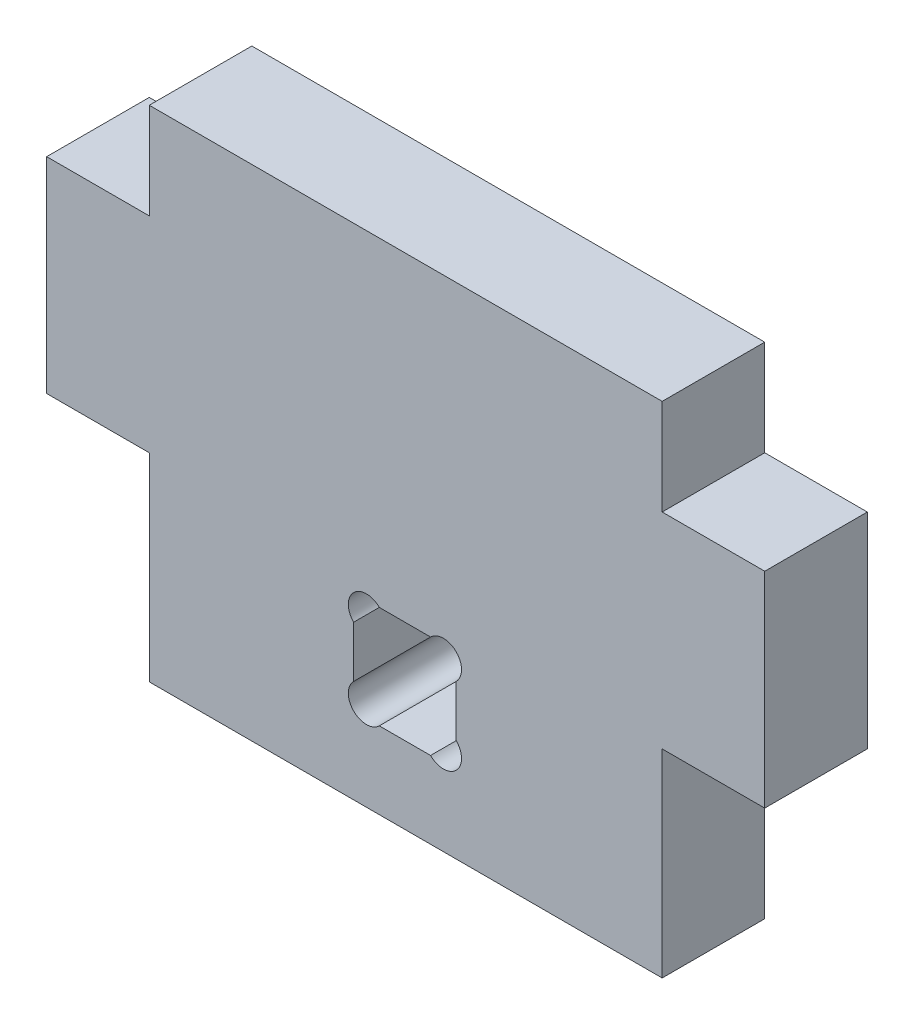
ISO-10303-21;
HEADER;
FILE_DESCRIPTION(('STEP AP214'),'2;1');
FILE_NAME('part.step','',(''),(''),'','','');
FILE_SCHEMA(('AUTOMOTIVE_DESIGN { 1 0 10303 214 1 1 1 1 }'));
ENDSEC;
DATA;
#1=APPLICATION_CONTEXT('core data for automotive mechanical design processes');
#2=APPLICATION_PROTOCOL_DEFINITION('international standard','automotive_design',2000,#1);
#3=PRODUCT_CONTEXT('',#1,'mechanical');
#4=PRODUCT('Part','Part','',(#3));
#5=PRODUCT_RELATED_PRODUCT_CATEGORY('part','',(#4));
#6=PRODUCT_DEFINITION_FORMATION('','',#4);
#7=PRODUCT_DEFINITION_CONTEXT('part definition',#1,'design');
#8=PRODUCT_DEFINITION('design','',#6,#7);
#9=PRODUCT_DEFINITION_SHAPE('','',#8);
#10=(LENGTH_UNIT() NAMED_UNIT(*) SI_UNIT(.MILLI.,.METRE.));
#11=(NAMED_UNIT(*) PLANE_ANGLE_UNIT() SI_UNIT($,.RADIAN.));
#12=(NAMED_UNIT(*) SI_UNIT($,.STERADIAN.) SOLID_ANGLE_UNIT());
#13=UNCERTAINTY_MEASURE_WITH_UNIT(LENGTH_MEASURE(1.E-05),#10,'distance_accuracy_value','');
#14=(GEOMETRIC_REPRESENTATION_CONTEXT(3) GLOBAL_UNCERTAINTY_ASSIGNED_CONTEXT((#13)) GLOBAL_UNIT_ASSIGNED_CONTEXT((#10,
#11,#12)) REPRESENTATION_CONTEXT('',''));
#15=CARTESIAN_POINT('',(0.,0.,0.));
#16=DIRECTION('',(0.,0.,1.));
#17=DIRECTION('',(1.,0.,0.));
#18=AXIS2_PLACEMENT_3D('',#15,#16,#17);
#19=CARTESIAN_POINT('',(-44.8631839710167,19.3598879782625,12.7));
#20=DIRECTION('',(1.,0.,0.));
#21=DIRECTION('',(0.,0.,-1.));
#22=AXIS2_PLACEMENT_3D('',#19,#20,#21);
#23=PLANE('',#22);
#24=DIRECTION('',(0.,-1.,0.));
#25=VECTOR('',#24,1.);
#26=CARTESIAN_POINT('',(-44.8631839710167,19.3598879782625,0.));
#27=LINE('',#26,#25);
#28=CARTESIAN_POINT('',(-44.8631839710167,19.3598879782625,0.));
#29=VERTEX_POINT('',#28);
#30=CARTESIAN_POINT('',(-44.8631839710167,-6.04011202173754,0.));
#31=VERTEX_POINT('',#30);
#32=EDGE_CURVE('E333',#29,#31,#27,.T.);
#33=ORIENTED_EDGE('',*,*,#32,.T.);
#34=DIRECTION('',(0.,0.,-1.));
#35=VECTOR('',#34,1.);
#36=CARTESIAN_POINT('',(-44.8631839710167,-6.04011202173754,12.7));
#37=LINE('',#36,#35);
#38=CARTESIAN_POINT('',(-44.8631839710167,-6.04011202173754,12.7));
#39=VERTEX_POINT('',#38);
#40=EDGE_CURVE('E12',#39,#31,#37,.T.);
#41=ORIENTED_EDGE('',*,*,#40,.F.);
#42=DIRECTION('',(0.,-1.,0.));
#43=VECTOR('',#42,1.);
#44=CARTESIAN_POINT('',(-44.8631839710167,19.3598879782625,12.7));
#45=LINE('',#44,#43);
#46=CARTESIAN_POINT('',(-44.8631839710167,19.3598879782625,12.7));
#47=VERTEX_POINT('',#46);
#48=EDGE_CURVE('E334',#47,#39,#45,.T.);
#49=ORIENTED_EDGE('',*,*,#48,.F.);
#50=DIRECTION('',(0.,0.,-1.));
#51=VECTOR('',#50,1.);
#52=CARTESIAN_POINT('',(-44.8631839710167,19.3598879782625,12.7));
#53=LINE('',#52,#51);
#54=EDGE_CURVE('E372',#47,#29,#53,.T.);
#55=ORIENTED_EDGE('',*,*,#54,.T.);
#56=EDGE_LOOP('',(#33,#41,#49,#55));
#57=FACE_BOUND('',#56,.T.);
#58=ADVANCED_FACE('F102',(#57),#23,.F.);
#59=CARTESIAN_POINT('',(-44.8631839710167,-6.04011202173754,12.7));
#60=DIRECTION('',(0.,1.,0.));
#61=DIRECTION('',(0.,0.,1.));
#62=AXIS2_PLACEMENT_3D('',#59,#60,#61);
#63=PLANE('',#62);
#64=DIRECTION('',(1.,0.,0.));
#65=VECTOR('',#64,1.);
#66=CARTESIAN_POINT('',(-44.8631839710167,-6.04011202173754,0.));
#67=LINE('',#66,#65);
#68=CARTESIAN_POINT('',(-32.1631839710167,-6.04011202173754,0.));
#69=VERTEX_POINT('',#68);
#70=EDGE_CURVE('E376',#31,#69,#67,.T.);
#71=ORIENTED_EDGE('',*,*,#70,.T.);
#72=DIRECTION('',(0.,0.,-1.));
#73=VECTOR('',#72,1.);
#74=CARTESIAN_POINT('',(-32.1631839710167,-6.04011202173754,12.7));
#75=LINE('',#74,#73);
#76=CARTESIAN_POINT('',(-32.1631839710167,-6.04011202173754,12.7));
#77=VERTEX_POINT('',#76);
#78=EDGE_CURVE('E110',#77,#69,#75,.T.);
#79=ORIENTED_EDGE('',*,*,#78,.F.);
#80=DIRECTION('',(1.,0.,0.));
#81=VECTOR('',#80,1.);
#82=CARTESIAN_POINT('',(-44.8631839710167,-6.04011202173754,12.7));
#83=LINE('',#82,#81);
#84=EDGE_CURVE('E338',#39,#77,#83,.T.);
#85=ORIENTED_EDGE('',*,*,#84,.F.);
#86=ORIENTED_EDGE('',*,*,#40,.T.);
#87=EDGE_LOOP('',(#71,#79,#85,#86));
#88=FACE_BOUND('',#87,.T.);
#89=ADVANCED_FACE('F473',(#88),#63,.F.);
#90=CARTESIAN_POINT('',(-32.1631839710167,-6.04011202173754,12.7));
#91=DIRECTION('',(1.,0.,0.));
#92=DIRECTION('',(0.,0.,-1.));
#93=AXIS2_PLACEMENT_3D('',#90,#91,#92);
#94=PLANE('',#93);
#95=DIRECTION('',(0.,-1.,0.));
#96=VECTOR('',#95,1.);
#97=CARTESIAN_POINT('',(-32.1631839710167,-6.04011202173754,0.));
#98=LINE('',#97,#96);
#99=CARTESIAN_POINT('',(-32.1631839710167,-30.6039814954239,0.));
#100=VERTEX_POINT('',#99);
#101=EDGE_CURVE('E379',#69,#100,#98,.T.);
#102=ORIENTED_EDGE('',*,*,#101,.T.);
#103=DIRECTION('',(0.,0.,-1.));
#104=VECTOR('',#103,1.);
#105=CARTESIAN_POINT('',(-32.1631839710167,-30.6039814954239,12.7));
#106=LINE('',#105,#104);
#107=CARTESIAN_POINT('',(-32.1631839710167,-30.6039814954239,12.7));
#108=VERTEX_POINT('',#107);
#109=EDGE_CURVE('E443',#108,#100,#106,.T.);
#110=ORIENTED_EDGE('',*,*,#109,.F.);
#111=DIRECTION('',(0.,-1.,0.));
#112=VECTOR('',#111,1.);
#113=CARTESIAN_POINT('',(-32.1631839710167,-6.04011202173754,12.7));
#114=LINE('',#113,#112);
#115=EDGE_CURVE('E342',#77,#108,#114,.T.);
#116=ORIENTED_EDGE('',*,*,#115,.F.);
#117=ORIENTED_EDGE('',*,*,#78,.T.);
#118=EDGE_LOOP('',(#102,#110,#116,#117));
#119=FACE_BOUND('',#118,.T.);
#120=ADVANCED_FACE('F452',(#119),#94,.F.);
#121=CARTESIAN_POINT('',(-32.1631839710167,-30.6039814954239,12.7));
#122=DIRECTION('',(0.,1.,0.));
#123=DIRECTION('',(0.,0.,1.));
#124=AXIS2_PLACEMENT_3D('',#121,#122,#123);
#125=PLANE('',#124);
#126=DIRECTION('',(1.,0.,0.));
#127=VECTOR('',#126,1.);
#128=CARTESIAN_POINT('',(-32.1631839710167,-30.6039814954239,0.));
#129=LINE('',#128,#127);
#130=CARTESIAN_POINT('',(31.3368160289834,-30.6039814954239,0.));
#131=VERTEX_POINT('',#130);
#132=EDGE_CURVE('E382',#100,#131,#129,.T.);
#133=ORIENTED_EDGE('',*,*,#132,.T.);
#134=DIRECTION('',(0.,0.,-1.));
#135=VECTOR('',#134,1.);
#136=CARTESIAN_POINT('',(31.3368160289834,-30.6039814954239,12.7));
#137=LINE('',#136,#135);
#138=CARTESIAN_POINT('',(31.3368160289834,-30.6039814954239,12.7));
#139=VERTEX_POINT('',#138);
#140=EDGE_CURVE('E439',#139,#131,#137,.T.);
#141=ORIENTED_EDGE('',*,*,#140,.F.);
#142=DIRECTION('',(1.,0.,0.));
#143=VECTOR('',#142,1.);
#144=CARTESIAN_POINT('',(-32.1631839710167,-30.6039814954239,12.7));
#145=LINE('',#144,#143);
#146=EDGE_CURVE('E345',#108,#139,#145,.T.);
#147=ORIENTED_EDGE('',*,*,#146,.F.);
#148=ORIENTED_EDGE('',*,*,#109,.T.);
#149=EDGE_LOOP('',(#133,#141,#147,#148));
#150=FACE_BOUND('',#149,.T.);
#151=ADVANCED_FACE('F463',(#150),#125,.F.);
#152=CARTESIAN_POINT('',(31.3368160289834,-6.04011202173754,12.7));
#153=DIRECTION('',(-1.,0.,0.));
#154=DIRECTION('',(0.,0.,1.));
#155=AXIS2_PLACEMENT_3D('',#152,#153,#154);
#156=PLANE('',#155);
#157=DIRECTION('',(0.,1.,0.));
#158=VECTOR('',#157,1.);
#159=CARTESIAN_POINT('',(31.3368160289834,-6.04011202173754,0.));
#160=LINE('',#159,#158);
#161=CARTESIAN_POINT('',(31.3368160289834,-6.04011202173754,0.));
#162=VERTEX_POINT('',#161);
#163=EDGE_CURVE('E385',#131,#162,#160,.T.);
#164=ORIENTED_EDGE('',*,*,#163,.T.);
#165=DIRECTION('',(0.,0.,-1.));
#166=VECTOR('',#165,1.);
#167=CARTESIAN_POINT('',(31.3368160289834,-6.04011202173754,12.7));
#168=LINE('',#167,#166);
#169=CARTESIAN_POINT('',(31.3368160289834,-6.04011202173754,12.7));
#170=VERTEX_POINT('',#169);
#171=EDGE_CURVE('E435',#170,#162,#168,.T.);
#172=ORIENTED_EDGE('',*,*,#171,.F.);
#173=DIRECTION('',(0.,1.,0.));
#174=VECTOR('',#173,1.);
#175=CARTESIAN_POINT('',(31.3368160289834,-6.04011202173754,12.7));
#176=LINE('',#175,#174);
#177=EDGE_CURVE('E348',#139,#170,#176,.T.);
#178=ORIENTED_EDGE('',*,*,#177,.F.);
#179=ORIENTED_EDGE('',*,*,#140,.T.);
#180=EDGE_LOOP('',(#164,#172,#178,#179));
#181=FACE_BOUND('',#180,.T.);
#182=ADVANCED_FACE('F467',(#181),#156,.F.);
#183=CARTESIAN_POINT('',(44.0368160289834,-6.04011202173754,12.7));
#184=DIRECTION('',(0.,1.,0.));
#185=DIRECTION('',(0.,0.,1.));
#186=AXIS2_PLACEMENT_3D('',#183,#184,#185);
#187=PLANE('',#186);
#188=DIRECTION('',(1.,0.,0.));
#189=VECTOR('',#188,1.);
#190=CARTESIAN_POINT('',(44.0368160289834,-6.04011202173754,0.));
#191=LINE('',#190,#189);
#192=CARTESIAN_POINT('',(44.0368160289834,-6.04011202173754,0.));
#193=VERTEX_POINT('',#192);
#194=EDGE_CURVE('E388',#162,#193,#191,.T.);
#195=ORIENTED_EDGE('',*,*,#194,.T.);
#196=DIRECTION('',(0.,0.,-1.));
#197=VECTOR('',#196,1.);
#198=CARTESIAN_POINT('',(44.0368160289834,-6.04011202173754,12.7));
#199=LINE('',#198,#197);
#200=CARTESIAN_POINT('',(44.0368160289834,-6.04011202173754,12.7));
#201=VERTEX_POINT('',#200);
#202=EDGE_CURVE('E431',#201,#193,#199,.T.);
#203=ORIENTED_EDGE('',*,*,#202,.F.);
#204=DIRECTION('',(1.,0.,0.));
#205=VECTOR('',#204,1.);
#206=CARTESIAN_POINT('',(44.0368160289834,-6.04011202173754,12.7));
#207=LINE('',#206,#205);
#208=EDGE_CURVE('E351',#170,#201,#207,.T.);
#209=ORIENTED_EDGE('',*,*,#208,.F.);
#210=ORIENTED_EDGE('',*,*,#171,.T.);
#211=EDGE_LOOP('',(#195,#203,#209,#210));
#212=FACE_BOUND('',#211,.T.);
#213=ADVANCED_FACE('F506',(#212),#187,.F.);
#214=CARTESIAN_POINT('',(44.0368160289834,19.3598879782625,12.7));
#215=DIRECTION('',(-1.,0.,0.));
#216=DIRECTION('',(0.,0.,1.));
#217=AXIS2_PLACEMENT_3D('',#214,#215,#216);
#218=PLANE('',#217);
#219=DIRECTION('',(0.,1.,0.));
#220=VECTOR('',#219,1.);
#221=CARTESIAN_POINT('',(44.0368160289834,19.3598879782625,0.));
#222=LINE('',#221,#220);
#223=CARTESIAN_POINT('',(44.0368160289834,19.3598879782625,0.));
#224=VERTEX_POINT('',#223);
#225=EDGE_CURVE('E391',#193,#224,#222,.T.);
#226=ORIENTED_EDGE('',*,*,#225,.T.);
#227=DIRECTION('',(0.,0.,-1.));
#228=VECTOR('',#227,1.);
#229=CARTESIAN_POINT('',(44.0368160289834,19.3598879782625,12.7));
#230=LINE('',#229,#228);
#231=CARTESIAN_POINT('',(44.0368160289834,19.3598879782625,12.7));
#232=VERTEX_POINT('',#231);
#233=EDGE_CURVE('E427',#232,#224,#230,.T.);
#234=ORIENTED_EDGE('',*,*,#233,.F.);
#235=DIRECTION('',(0.,1.,0.));
#236=VECTOR('',#235,1.);
#237=CARTESIAN_POINT('',(44.0368160289834,19.3598879782625,12.7));
#238=LINE('',#237,#236);
#239=EDGE_CURVE('E354',#201,#232,#238,.T.);
#240=ORIENTED_EDGE('',*,*,#239,.F.);
#241=ORIENTED_EDGE('',*,*,#202,.T.);
#242=EDGE_LOOP('',(#226,#234,#240,#241));
#243=FACE_BOUND('',#242,.T.);
#244=ADVANCED_FACE('F504',(#243),#218,.F.);
#245=CARTESIAN_POINT('',(44.0368160289834,19.3598879782625,12.7));
#246=DIRECTION('',(0.,-1.,0.));
#247=DIRECTION('',(0.,0.,-1.));
#248=AXIS2_PLACEMENT_3D('',#245,#246,#247);
#249=PLANE('',#248);
#250=DIRECTION('',(-1.,0.,0.));
#251=VECTOR('',#250,1.);
#252=CARTESIAN_POINT('',(44.0368160289834,19.3598879782625,0.));
#253=LINE('',#252,#251);
#254=CARTESIAN_POINT('',(31.3368160289834,19.3598879782625,0.));
#255=VERTEX_POINT('',#254);
#256=EDGE_CURVE('E394',#224,#255,#253,.T.);
#257=ORIENTED_EDGE('',*,*,#256,.T.);
#258=DIRECTION('',(0.,0.,-1.));
#259=VECTOR('',#258,1.);
#260=CARTESIAN_POINT('',(31.3368160289834,19.3598879782625,12.7));
#261=LINE('',#260,#259);
#262=CARTESIAN_POINT('',(31.3368160289834,19.3598879782625,12.7));
#263=VERTEX_POINT('',#262);
#264=EDGE_CURVE('E423',#263,#255,#261,.T.);
#265=ORIENTED_EDGE('',*,*,#264,.F.);
#266=DIRECTION('',(-1.,0.,0.));
#267=VECTOR('',#266,1.);
#268=CARTESIAN_POINT('',(44.0368160289834,19.3598879782625,12.7));
#269=LINE('',#268,#267);
#270=EDGE_CURVE('E357',#232,#263,#269,.T.);
#271=ORIENTED_EDGE('',*,*,#270,.F.);
#272=ORIENTED_EDGE('',*,*,#233,.T.);
#273=EDGE_LOOP('',(#257,#265,#271,#272));
#274=FACE_BOUND('',#273,.T.);
#275=ADVANCED_FACE('F500',(#274),#249,.F.);
#276=CARTESIAN_POINT('',(31.3368160289834,31.2237574519488,12.7));
#277=DIRECTION('',(-1.,0.,0.));
#278=DIRECTION('',(0.,0.,1.));
#279=AXIS2_PLACEMENT_3D('',#276,#277,#278);
#280=PLANE('',#279);
#281=DIRECTION('',(0.,1.,0.));
#282=VECTOR('',#281,1.);
#283=CARTESIAN_POINT('',(31.3368160289834,31.2237574519488,0.));
#284=LINE('',#283,#282);
#285=CARTESIAN_POINT('',(31.3368160289834,31.2237574519488,0.));
#286=VERTEX_POINT('',#285);
#287=EDGE_CURVE('E397',#255,#286,#284,.T.);
#288=ORIENTED_EDGE('',*,*,#287,.T.);
#289=DIRECTION('',(0.,0.,-1.));
#290=VECTOR('',#289,1.);
#291=CARTESIAN_POINT('',(31.3368160289834,31.2237574519488,12.7));
#292=LINE('',#291,#290);
#293=CARTESIAN_POINT('',(31.3368160289834,31.2237574519488,12.7));
#294=VERTEX_POINT('',#293);
#295=EDGE_CURVE('E419',#294,#286,#292,.T.);
#296=ORIENTED_EDGE('',*,*,#295,.F.);
#297=DIRECTION('',(0.,1.,0.));
#298=VECTOR('',#297,1.);
#299=CARTESIAN_POINT('',(31.3368160289834,31.2237574519488,12.7));
#300=LINE('',#299,#298);
#301=EDGE_CURVE('E360',#263,#294,#300,.T.);
#302=ORIENTED_EDGE('',*,*,#301,.F.);
#303=ORIENTED_EDGE('',*,*,#264,.T.);
#304=EDGE_LOOP('',(#288,#296,#302,#303));
#305=FACE_BOUND('',#304,.T.);
#306=ADVANCED_FACE('F495',(#305),#280,.F.);
#307=CARTESIAN_POINT('',(-32.1631839710167,31.2237574519488,12.7));
#308=DIRECTION('',(0.,-1.,0.));
#309=DIRECTION('',(0.,0.,-1.));
#310=AXIS2_PLACEMENT_3D('',#307,#308,#309);
#311=PLANE('',#310);
#312=DIRECTION('',(-1.,0.,0.));
#313=VECTOR('',#312,1.);
#314=CARTESIAN_POINT('',(-32.1631839710167,31.2237574519488,0.));
#315=LINE('',#314,#313);
#316=CARTESIAN_POINT('',(-32.1631839710167,31.2237574519488,0.));
#317=VERTEX_POINT('',#316);
#318=EDGE_CURVE('E400',#286,#317,#315,.T.);
#319=ORIENTED_EDGE('',*,*,#318,.T.);
#320=DIRECTION('',(0.,0.,-1.));
#321=VECTOR('',#320,1.);
#322=CARTESIAN_POINT('',(-32.1631839710167,31.2237574519488,12.7));
#323=LINE('',#322,#321);
#324=CARTESIAN_POINT('',(-32.1631839710167,31.2237574519488,12.7));
#325=VERTEX_POINT('',#324);
#326=EDGE_CURVE('E415',#325,#317,#323,.T.);
#327=ORIENTED_EDGE('',*,*,#326,.F.);
#328=DIRECTION('',(-1.,0.,0.));
#329=VECTOR('',#328,1.);
#330=CARTESIAN_POINT('',(-32.1631839710167,31.2237574519488,12.7));
#331=LINE('',#330,#329);
#332=EDGE_CURVE('E363',#294,#325,#331,.T.);
#333=ORIENTED_EDGE('',*,*,#332,.F.);
#334=ORIENTED_EDGE('',*,*,#295,.T.);
#335=EDGE_LOOP('',(#319,#327,#333,#334));
#336=FACE_BOUND('',#335,.T.);
#337=ADVANCED_FACE('F489',(#336),#311,.F.);
#338=CARTESIAN_POINT('',(-32.1631839710167,31.2237574519488,12.7));
#339=DIRECTION('',(1.,0.,0.));
#340=DIRECTION('',(0.,0.,-1.));
#341=AXIS2_PLACEMENT_3D('',#338,#339,#340);
#342=PLANE('',#341);
#343=DIRECTION('',(0.,-1.,0.));
#344=VECTOR('',#343,1.);
#345=CARTESIAN_POINT('',(-32.1631839710167,31.2237574519488,0.));
#346=LINE('',#345,#344);
#347=CARTESIAN_POINT('',(-32.1631839710167,19.3598879782625,0.));
#348=VERTEX_POINT('',#347);
#349=EDGE_CURVE('E403',#317,#348,#346,.T.);
#350=ORIENTED_EDGE('',*,*,#349,.T.);
#351=DIRECTION('',(0.,0.,-1.));
#352=VECTOR('',#351,1.);
#353=CARTESIAN_POINT('',(-32.1631839710167,19.3598879782625,12.7));
#354=LINE('',#353,#352);
#355=CARTESIAN_POINT('',(-32.1631839710167,19.3598879782625,12.7));
#356=VERTEX_POINT('',#355);
#357=EDGE_CURVE('E411',#356,#348,#354,.T.);
#358=ORIENTED_EDGE('',*,*,#357,.F.);
#359=DIRECTION('',(0.,-1.,0.));
#360=VECTOR('',#359,1.);
#361=CARTESIAN_POINT('',(-32.1631839710167,31.2237574519488,12.7));
#362=LINE('',#361,#360);
#363=EDGE_CURVE('E366',#325,#356,#362,.T.);
#364=ORIENTED_EDGE('',*,*,#363,.F.);
#365=ORIENTED_EDGE('',*,*,#326,.T.);
#366=EDGE_LOOP('',(#350,#358,#364,#365));
#367=FACE_BOUND('',#366,.T.);
#368=ADVANCED_FACE('F485',(#367),#342,.F.);
#369=CARTESIAN_POINT('',(-44.8631839710167,19.3598879782625,12.7));
#370=DIRECTION('',(0.,-1.,0.));
#371=DIRECTION('',(0.,0.,-1.));
#372=AXIS2_PLACEMENT_3D('',#369,#370,#371);
#373=PLANE('',#372);
#374=DIRECTION('',(-1.,0.,0.));
#375=VECTOR('',#374,1.);
#376=CARTESIAN_POINT('',(-44.8631839710167,19.3598879782625,0.));
#377=LINE('',#376,#375);
#378=EDGE_CURVE('E339',#348,#29,#377,.T.);
#379=ORIENTED_EDGE('',*,*,#378,.T.);
#380=ORIENTED_EDGE('',*,*,#54,.F.);
#381=DIRECTION('',(-1.,0.,0.));
#382=VECTOR('',#381,1.);
#383=CARTESIAN_POINT('',(-44.8631839710167,19.3598879782625,12.7));
#384=LINE('',#383,#382);
#385=EDGE_CURVE('E369',#356,#47,#384,.T.);
#386=ORIENTED_EDGE('',*,*,#385,.F.);
#387=ORIENTED_EDGE('',*,*,#357,.T.);
#388=EDGE_LOOP('',(#379,#380,#386,#387));
#389=FACE_BOUND('',#388,.T.);
#390=ADVANCED_FACE('F480',(#389),#373,.F.);
#391=CARTESIAN_POINT('',(0.,0.,12.7));
#392=DIRECTION('',(0.,0.,1.));
#393=DIRECTION('',(1.,0.,0.));
#394=AXIS2_PLACEMENT_3D('',#391,#392,#393);
#395=PLANE('',#394);
#396=DIRECTION('',(0.,1.,0.));
#397=VECTOR('',#396,1.);
#398=CARTESIAN_POINT('',(5.83887009919972,-21.0789814954239,12.7));
#399=LINE('',#398,#397);
#400=CARTESIAN_POINT('',(5.83887009919972,-17.9035629585965,12.7));
#401=VERTEX_POINT('',#400);
#402=CARTESIAN_POINT('',(5.83887009919972,-11.5544000322513,12.7));
#403=VERTEX_POINT('',#402);
#404=EDGE_CURVE('E256',#401,#403,#399,.T.);
#405=ORIENTED_EDGE('',*,*,#404,.F.);
#406=CARTESIAN_POINT('',(4.25137009919972,-19.4914814954239,12.7));
#407=DIRECTION('',(0.,0.,1.));
#408=DIRECTION('',(1.,0.,0.));
#409=AXIS2_PLACEMENT_3D('',#406,#407,#408);
#410=CIRCLE('',#409,2.24536);
#411=CARTESIAN_POINT('',(2.66345156237234,-21.0789814954239,12.7));
#412=VERTEX_POINT('',#411);
#413=EDGE_CURVE('E293',#412,#401,#410,.T.);
#414=ORIENTED_EDGE('',*,*,#413,.F.);
#415=DIRECTION('',(1.,0.,0.));
#416=VECTOR('',#415,1.);
#417=CARTESIAN_POINT('',(-6.86112990080028,-21.0789814954239,12.7));
#418=LINE('',#417,#416);
#419=CARTESIAN_POINT('',(-3.6857113639729,-21.0789814954239,12.7));
#420=VERTEX_POINT('',#419);
#421=EDGE_CURVE('E303',#420,#412,#418,.T.);
#422=ORIENTED_EDGE('',*,*,#421,.F.);
#423=CARTESIAN_POINT('',(-5.27362990080028,-19.4914814954239,12.7));
#424=DIRECTION('',(0.,0.,-1.));
#425=DIRECTION('',(-1.,0.,0.));
#426=AXIS2_PLACEMENT_3D('',#423,#424,#425);
#427=CIRCLE('',#426,2.24536);
#428=CARTESIAN_POINT('',(-6.86112990080028,-17.9035629585965,12.7));
#429=VERTEX_POINT('',#428);
#430=EDGE_CURVE('E284',#420,#429,#427,.T.);
#431=ORIENTED_EDGE('',*,*,#430,.T.);
#432=DIRECTION('',(0.,1.,0.));
#433=VECTOR('',#432,1.);
#434=CARTESIAN_POINT('',(-6.86112990080028,-21.0789814954239,12.7));
#435=LINE('',#434,#433);
#436=CARTESIAN_POINT('',(-6.86112990080028,-11.5544000322513,12.7));
#437=VERTEX_POINT('',#436);
#438=EDGE_CURVE('E257',#429,#437,#435,.T.);
#439=ORIENTED_EDGE('',*,*,#438,.T.);
#440=CARTESIAN_POINT('',(-5.27362990080028,-9.96648149542391,12.7));
#441=DIRECTION('',(0.,0.,1.));
#442=DIRECTION('',(1.,0.,0.));
#443=AXIS2_PLACEMENT_3D('',#440,#441,#442);
#444=CIRCLE('',#443,2.24536);
#445=CARTESIAN_POINT('',(-3.6857113639729,-8.37898149542391,12.7));
#446=VERTEX_POINT('',#445);
#447=EDGE_CURVE('E117',#446,#437,#444,.T.);
#448=ORIENTED_EDGE('',*,*,#447,.F.);
#449=DIRECTION('',(1.,0.,0.));
#450=VECTOR('',#449,1.);
#451=CARTESIAN_POINT('',(-6.86112990080028,-8.37898149542391,12.7));
#452=LINE('',#451,#450);
#453=CARTESIAN_POINT('',(2.66345156237234,-8.37898149542391,12.7));
#454=VERTEX_POINT('',#453);
#455=EDGE_CURVE('E248',#446,#454,#452,.T.);
#456=ORIENTED_EDGE('',*,*,#455,.T.);
#457=CARTESIAN_POINT('',(4.25137009919972,-9.96648149542391,12.7));
#458=DIRECTION('',(0.,0.,-1.));
#459=DIRECTION('',(-1.,0.,0.));
#460=AXIS2_PLACEMENT_3D('',#457,#458,#459);
#461=CIRCLE('',#460,2.24536);
#462=EDGE_CURVE('E277',#454,#403,#461,.T.);
#463=ORIENTED_EDGE('',*,*,#462,.T.);
#464=EDGE_LOOP('',(#405,#414,#422,#431,#439,#448,#456,#463));
#465=FACE_BOUND('',#464,.T.);
#466=ORIENTED_EDGE('',*,*,#48,.T.);
#467=ORIENTED_EDGE('',*,*,#84,.T.);
#468=ORIENTED_EDGE('',*,*,#115,.T.);
#469=ORIENTED_EDGE('',*,*,#146,.T.);
#470=ORIENTED_EDGE('',*,*,#177,.T.);
#471=ORIENTED_EDGE('',*,*,#208,.T.);
#472=ORIENTED_EDGE('',*,*,#239,.T.);
#473=ORIENTED_EDGE('',*,*,#270,.T.);
#474=ORIENTED_EDGE('',*,*,#301,.T.);
#475=ORIENTED_EDGE('',*,*,#332,.T.);
#476=ORIENTED_EDGE('',*,*,#363,.T.);
#477=ORIENTED_EDGE('',*,*,#385,.T.);
#478=EDGE_LOOP('',(#466,#467,#468,#469,#470,#471,#472,#473,#474,#475,#476,#477));
#479=FACE_BOUND('',#478,.T.);
#480=ADVANCED_FACE('F261',(#465,#479),#395,.T.);
#481=CARTESIAN_POINT('',(0.,0.,0.));
#482=DIRECTION('',(0.,0.,1.));
#483=DIRECTION('',(1.,0.,0.));
#484=AXIS2_PLACEMENT_3D('',#481,#482,#483);
#485=PLANE('',#484);
#486=CARTESIAN_POINT('',(4.25137009919972,-19.4914814954239,0.));
#487=DIRECTION('',(0.,0.,1.));
#488=DIRECTION('',(1.,0.,0.));
#489=AXIS2_PLACEMENT_3D('',#486,#487,#488);
#490=CIRCLE('',#489,2.24536);
#491=CARTESIAN_POINT('',(2.66345156237234,-21.0789814954239,0.));
#492=VERTEX_POINT('',#491);
#493=CARTESIAN_POINT('',(5.83887009919972,-17.9035629585965,0.));
#494=VERTEX_POINT('',#493);
#495=EDGE_CURVE('E288',#492,#494,#490,.T.);
#496=ORIENTED_EDGE('',*,*,#495,.T.);
#497=DIRECTION('',(0.,1.,0.));
#498=VECTOR('',#497,1.);
#499=CARTESIAN_POINT('',(5.83887009919972,-21.0789814954239,0.));
#500=LINE('',#499,#498);
#501=CARTESIAN_POINT('',(5.83887009919972,-11.5544000322513,0.));
#502=VERTEX_POINT('',#501);
#503=EDGE_CURVE('E306',#494,#502,#500,.T.);
#504=ORIENTED_EDGE('',*,*,#503,.T.);
#505=CARTESIAN_POINT('',(4.25137009919972,-9.96648149542391,0.));
#506=DIRECTION('',(0.,0.,-1.));
#507=DIRECTION('',(-1.,0.,0.));
#508=AXIS2_PLACEMENT_3D('',#505,#506,#507);
#509=CIRCLE('',#508,2.24536);
#510=CARTESIAN_POINT('',(2.66345156237234,-8.37898149542391,0.));
#511=VERTEX_POINT('',#510);
#512=EDGE_CURVE('E273',#511,#502,#509,.T.);
#513=ORIENTED_EDGE('',*,*,#512,.F.);
#514=DIRECTION('',(1.,0.,0.));
#515=VECTOR('',#514,1.);
#516=CARTESIAN_POINT('',(-6.86112990080028,-8.37898149542391,0.));
#517=LINE('',#516,#515);
#518=CARTESIAN_POINT('',(-3.6857113639729,-8.37898149542391,0.));
#519=VERTEX_POINT('',#518);
#520=EDGE_CURVE('E302',#519,#511,#517,.T.);
#521=ORIENTED_EDGE('',*,*,#520,.F.);
#522=CARTESIAN_POINT('',(-5.27362990080028,-9.96648149542391,0.));
#523=DIRECTION('',(0.,0.,1.));
#524=DIRECTION('',(1.,0.,0.));
#525=AXIS2_PLACEMENT_3D('',#522,#523,#524);
#526=CIRCLE('',#525,2.24536);
#527=CARTESIAN_POINT('',(-6.86112990080028,-11.5544000322513,0.));
#528=VERTEX_POINT('',#527);
#529=EDGE_CURVE('E241',#519,#528,#526,.T.);
#530=ORIENTED_EDGE('',*,*,#529,.T.);
#531=DIRECTION('',(0.,1.,0.));
#532=VECTOR('',#531,1.);
#533=CARTESIAN_POINT('',(-6.86112990080028,-21.0789814954239,0.));
#534=LINE('',#533,#532);
#535=CARTESIAN_POINT('',(-6.86112990080028,-17.9035629585965,0.));
#536=VERTEX_POINT('',#535);
#537=EDGE_CURVE('E298',#536,#528,#534,.T.);
#538=ORIENTED_EDGE('',*,*,#537,.F.);
#539=CARTESIAN_POINT('',(-5.27362990080028,-19.4914814954239,0.));
#540=DIRECTION('',(0.,0.,-1.));
#541=DIRECTION('',(-1.,0.,0.));
#542=AXIS2_PLACEMENT_3D('',#539,#540,#541);
#543=CIRCLE('',#542,2.24536);
#544=CARTESIAN_POINT('',(-3.6857113639729,-21.0789814954239,0.));
#545=VERTEX_POINT('',#544);
#546=EDGE_CURVE('E125',#545,#536,#543,.T.);
#547=ORIENTED_EDGE('',*,*,#546,.F.);
#548=DIRECTION('',(1.,0.,0.));
#549=VECTOR('',#548,1.);
#550=CARTESIAN_POINT('',(-6.86112990080028,-21.0789814954239,0.));
#551=LINE('',#550,#549);
#552=EDGE_CURVE('E297',#545,#492,#551,.T.);
#553=ORIENTED_EDGE('',*,*,#552,.T.);
#554=EDGE_LOOP('',(#496,#504,#513,#521,#530,#538,#547,#553));
#555=FACE_BOUND('',#554,.T.);
#556=ORIENTED_EDGE('',*,*,#32,.F.);
#557=ORIENTED_EDGE('',*,*,#378,.F.);
#558=ORIENTED_EDGE('',*,*,#349,.F.);
#559=ORIENTED_EDGE('',*,*,#318,.F.);
#560=ORIENTED_EDGE('',*,*,#287,.F.);
#561=ORIENTED_EDGE('',*,*,#256,.F.);
#562=ORIENTED_EDGE('',*,*,#225,.F.);
#563=ORIENTED_EDGE('',*,*,#194,.F.);
#564=ORIENTED_EDGE('',*,*,#163,.F.);
#565=ORIENTED_EDGE('',*,*,#132,.F.);
#566=ORIENTED_EDGE('',*,*,#101,.F.);
#567=ORIENTED_EDGE('',*,*,#70,.F.);
#568=EDGE_LOOP('',(#556,#557,#558,#559,#560,#561,#562,#563,#564,#565,#566,#567));
#569=FACE_BOUND('',#568,.T.);
#570=ADVANCED_FACE('F458',(#555,#569),#485,.F.);
#571=CARTESIAN_POINT('',(-5.27362990080028,-9.96648149542391,0.));
#572=DIRECTION('',(0.,0.,1.));
#573=DIRECTION('',(1.,0.,0.));
#574=AXIS2_PLACEMENT_3D('',#571,#572,#573);
#575=CYLINDRICAL_SURFACE('',#574,2.24536);
#576=ORIENTED_EDGE('',*,*,#529,.F.);
#577=DIRECTION('',(0.,0.,1.));
#578=VECTOR('',#577,1.);
#579=CARTESIAN_POINT('',(-3.6857113639729,-8.37898149542391,0.));
#580=LINE('',#579,#578);
#581=EDGE_CURVE('E237',#446,#519,#580,.F.);
#582=ORIENTED_EDGE('',*,*,#581,.F.);
#583=ORIENTED_EDGE('',*,*,#447,.T.);
#584=DIRECTION('',(0.,0.,1.));
#585=VECTOR('',#584,1.);
#586=CARTESIAN_POINT('',(-6.86112990080028,-11.5544000322513,0.));
#587=LINE('',#586,#585);
#588=EDGE_CURVE('E245',#528,#437,#587,.T.);
#589=ORIENTED_EDGE('',*,*,#588,.F.);
#590=EDGE_LOOP('',(#576,#582,#583,#589));
#591=FACE_BOUND('',#590,.T.);
#592=ADVANCED_FACE('F239',(#591),#575,.F.);
#593=CARTESIAN_POINT('',(4.25137009919972,-19.4914814954239,0.));
#594=DIRECTION('',(0.,0.,1.));
#595=DIRECTION('',(1.,0.,0.));
#596=AXIS2_PLACEMENT_3D('',#593,#594,#595);
#597=CYLINDRICAL_SURFACE('',#596,2.24536);
#598=DIRECTION('',(0.,0.,1.));
#599=VECTOR('',#598,1.);
#600=CARTESIAN_POINT('',(5.83887009919972,-17.9035629585965,0.));
#601=LINE('',#600,#599);
#602=EDGE_CURVE('E287',#401,#494,#601,.F.);
#603=ORIENTED_EDGE('',*,*,#602,.T.);
#604=ORIENTED_EDGE('',*,*,#495,.F.);
#605=DIRECTION('',(0.,0.,1.));
#606=VECTOR('',#605,1.);
#607=CARTESIAN_POINT('',(2.66345156237234,-21.0789814954239,0.));
#608=LINE('',#607,#606);
#609=EDGE_CURVE('E292',#492,#412,#608,.T.);
#610=ORIENTED_EDGE('',*,*,#609,.T.);
#611=ORIENTED_EDGE('',*,*,#413,.T.);
#612=EDGE_LOOP('',(#603,#604,#610,#611));
#613=FACE_BOUND('',#612,.T.);
#614=ADVANCED_FACE('F613',(#613),#597,.F.);
#615=CARTESIAN_POINT('',(-5.27362990080028,-19.4914814954239,0.));
#616=DIRECTION('',(0.,0.,1.));
#617=DIRECTION('',(1.,0.,0.));
#618=AXIS2_PLACEMENT_3D('',#615,#616,#617);
#619=CYLINDRICAL_SURFACE('',#618,2.24536);
#620=ORIENTED_EDGE('',*,*,#546,.T.);
#621=DIRECTION('',(0.,0.,1.));
#622=VECTOR('',#621,1.);
#623=CARTESIAN_POINT('',(-6.86112990080028,-17.9035629585965,0.));
#624=LINE('',#623,#622);
#625=EDGE_CURVE('E283',#536,#429,#624,.T.);
#626=ORIENTED_EDGE('',*,*,#625,.T.);
#627=ORIENTED_EDGE('',*,*,#430,.F.);
#628=DIRECTION('',(0.,0.,1.));
#629=VECTOR('',#628,1.);
#630=CARTESIAN_POINT('',(-3.6857113639729,-21.0789814954239,0.));
#631=LINE('',#630,#629);
#632=EDGE_CURVE('E280',#545,#420,#631,.T.);
#633=ORIENTED_EDGE('',*,*,#632,.F.);
#634=EDGE_LOOP('',(#620,#626,#627,#633));
#635=FACE_BOUND('',#634,.T.);
#636=ADVANCED_FACE('F624',(#635),#619,.F.);
#637=CARTESIAN_POINT('',(4.25137009919972,-9.96648149542391,0.));
#638=DIRECTION('',(0.,0.,1.));
#639=DIRECTION('',(1.,0.,0.));
#640=AXIS2_PLACEMENT_3D('',#637,#638,#639);
#641=CYLINDRICAL_SURFACE('',#640,2.24536);
#642=DIRECTION('',(0.,0.,1.));
#643=VECTOR('',#642,1.);
#644=CARTESIAN_POINT('',(2.66345156237234,-8.37898149542391,0.));
#645=LINE('',#644,#643);
#646=EDGE_CURVE('E251',#454,#511,#645,.F.);
#647=ORIENTED_EDGE('',*,*,#646,.T.);
#648=ORIENTED_EDGE('',*,*,#512,.T.);
#649=DIRECTION('',(0.,0.,1.));
#650=VECTOR('',#649,1.);
#651=CARTESIAN_POINT('',(5.83887009919972,-11.5544000322513,0.));
#652=LINE('',#651,#650);
#653=EDGE_CURVE('E270',#403,#502,#652,.F.);
#654=ORIENTED_EDGE('',*,*,#653,.F.);
#655=ORIENTED_EDGE('',*,*,#462,.F.);
#656=EDGE_LOOP('',(#647,#648,#654,#655));
#657=FACE_BOUND('',#656,.T.);
#658=ADVANCED_FACE('F615',(#657),#641,.F.);
#659=CARTESIAN_POINT('',(-6.86112990080028,-8.37898149542391,0.));
#660=DIRECTION('',(0.,-1.,0.));
#661=DIRECTION('',(0.,0.,-1.));
#662=AXIS2_PLACEMENT_3D('',#659,#660,#661);
#663=PLANE('',#662);
#664=ORIENTED_EDGE('',*,*,#581,.T.);
#665=ORIENTED_EDGE('',*,*,#520,.T.);
#666=ORIENTED_EDGE('',*,*,#646,.F.);
#667=ORIENTED_EDGE('',*,*,#455,.F.);
#668=EDGE_LOOP('',(#664,#665,#666,#667));
#669=FACE_BOUND('',#668,.T.);
#670=ADVANCED_FACE('F249',(#669),#663,.T.);
#671=CARTESIAN_POINT('',(5.83887009919972,-21.0789814954239,0.));
#672=DIRECTION('',(1.,0.,0.));
#673=DIRECTION('',(0.,0.,-1.));
#674=AXIS2_PLACEMENT_3D('',#671,#672,#673);
#675=PLANE('',#674);
#676=ORIENTED_EDGE('',*,*,#653,.T.);
#677=ORIENTED_EDGE('',*,*,#503,.F.);
#678=ORIENTED_EDGE('',*,*,#602,.F.);
#679=ORIENTED_EDGE('',*,*,#404,.T.);
#680=EDGE_LOOP('',(#676,#677,#678,#679));
#681=FACE_BOUND('',#680,.T.);
#682=ADVANCED_FACE('F638',(#681),#675,.F.);
#683=CARTESIAN_POINT('',(-6.86112990080028,-21.0789814954239,0.));
#684=DIRECTION('',(0.,-1.,0.));
#685=DIRECTION('',(0.,0.,-1.));
#686=AXIS2_PLACEMENT_3D('',#683,#684,#685);
#687=PLANE('',#686);
#688=ORIENTED_EDGE('',*,*,#632,.T.);
#689=ORIENTED_EDGE('',*,*,#421,.T.);
#690=ORIENTED_EDGE('',*,*,#609,.F.);
#691=ORIENTED_EDGE('',*,*,#552,.F.);
#692=EDGE_LOOP('',(#688,#689,#690,#691));
#693=FACE_BOUND('',#692,.T.);
#694=ADVANCED_FACE('F637',(#693),#687,.F.);
#695=CARTESIAN_POINT('',(-6.86112990080028,-21.0789814954239,0.));
#696=DIRECTION('',(1.,0.,0.));
#697=DIRECTION('',(0.,0.,-1.));
#698=AXIS2_PLACEMENT_3D('',#695,#696,#697);
#699=PLANE('',#698);
#700=ORIENTED_EDGE('',*,*,#588,.T.);
#701=ORIENTED_EDGE('',*,*,#438,.F.);
#702=ORIENTED_EDGE('',*,*,#625,.F.);
#703=ORIENTED_EDGE('',*,*,#537,.T.);
#704=EDGE_LOOP('',(#700,#701,#702,#703));
#705=FACE_BOUND('',#704,.T.);
#706=ADVANCED_FACE('F627',(#705),#699,.T.);
#707=CLOSED_SHELL('',(#58,#89,#120,#151,#182,#213,#244,#275,#306,#337,#368,#390,#480,#570,#592,
#614,#636,#658,#670,#682,#694,#706));
#708=MANIFOLD_SOLID_BREP('B2',#707);
#709=ADVANCED_BREP_SHAPE_REPRESENTATION('',(#18,#708),#14);
#710=SHAPE_DEFINITION_REPRESENTATION(#9,#709);
ENDSEC;
END-ISO-10303-21;
